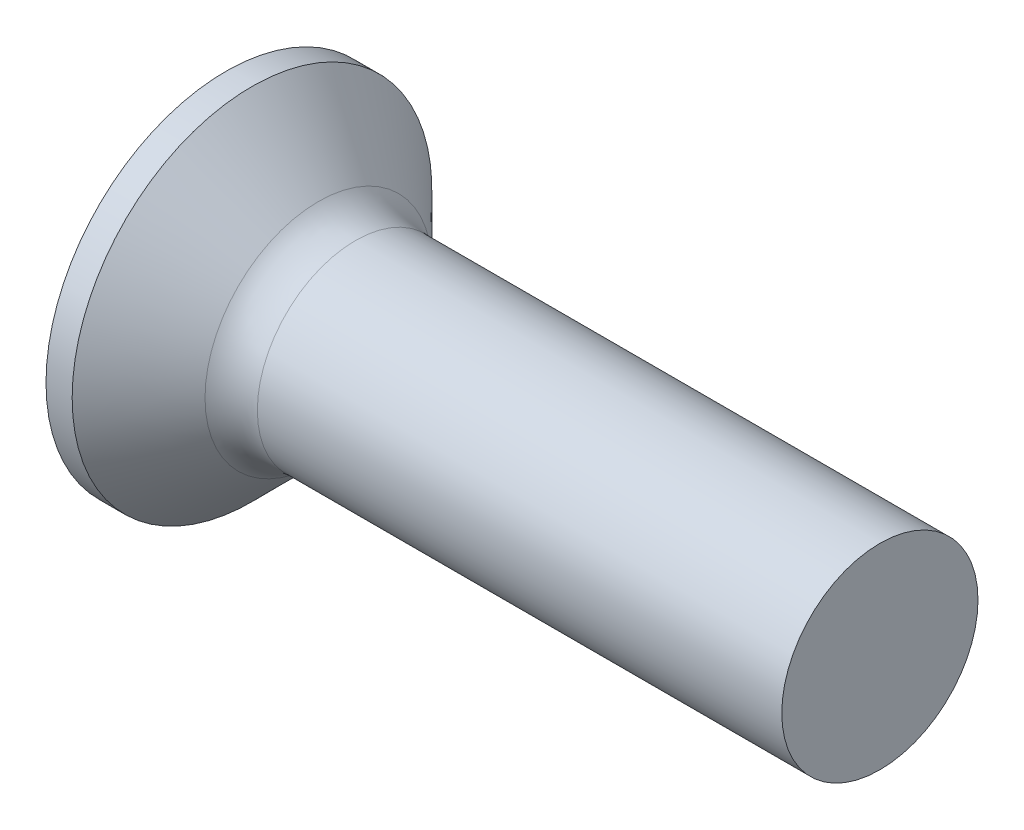
ISO-10303-21;
HEADER;
FILE_DESCRIPTION(('STEP AP214'),'2;1');
FILE_NAME('part.step','',(''),(''),'','','');
FILE_SCHEMA(('AUTOMOTIVE_DESIGN { 1 0 10303 214 1 1 1 1 }'));
ENDSEC;
DATA;
#1=APPLICATION_CONTEXT('core data for automotive mechanical design processes');
#2=APPLICATION_PROTOCOL_DEFINITION('international standard','automotive_design',2000,#1);
#3=PRODUCT_CONTEXT('',#1,'mechanical');
#4=PRODUCT('Part','Part','',(#3));
#5=PRODUCT_RELATED_PRODUCT_CATEGORY('part','',(#4));
#6=PRODUCT_DEFINITION_FORMATION('','',#4);
#7=PRODUCT_DEFINITION_CONTEXT('part definition',#1,'design');
#8=PRODUCT_DEFINITION('design','',#6,#7);
#9=PRODUCT_DEFINITION_SHAPE('','',#8);
#10=(LENGTH_UNIT() NAMED_UNIT(*) SI_UNIT(.MILLI.,.METRE.));
#11=(NAMED_UNIT(*) PLANE_ANGLE_UNIT() SI_UNIT($,.RADIAN.));
#12=(NAMED_UNIT(*) SI_UNIT($,.STERADIAN.) SOLID_ANGLE_UNIT());
#13=UNCERTAINTY_MEASURE_WITH_UNIT(LENGTH_MEASURE(1.E-05),#10,'distance_accuracy_value','');
#14=(GEOMETRIC_REPRESENTATION_CONTEXT(3) GLOBAL_UNCERTAINTY_ASSIGNED_CONTEXT((#13)) GLOBAL_UNIT_ASSIGNED_CONTEXT((#10,
#11,#12)) REPRESENTATION_CONTEXT('',''));
#15=CARTESIAN_POINT('',(0.,0.,0.));
#16=DIRECTION('',(0.,0.,1.));
#17=DIRECTION('',(1.,0.,0.));
#18=AXIS2_PLACEMENT_3D('',#15,#16,#17);
#19=CARTESIAN_POINT('',(2.01,-0.497851135403416,0.37));
#20=DIRECTION('',(0.,0.,-1.));
#21=DIRECTION('',(-1.,0.,0.));
#22=AXIS2_PLACEMENT_3D('',#19,#20,#21);
#23=PLANE('',#22);
#24=DIRECTION('',(0.,-1.,0.));
#25=VECTOR('',#24,1.);
#26=CARTESIAN_POINT('',(0.,1.5,0.37));
#27=LINE('',#26,#25);
#28=CARTESIAN_POINT('',(0.,-0.590157547916262,0.37));
#29=VERTEX_POINT('',#28);
#30=CARTESIAN_POINT('',(0.,-1.5,0.37));
#31=VERTEX_POINT('',#30);
#32=EDGE_CURVE('E462',#29,#31,#27,.T.);
#33=ORIENTED_EDGE('',*,*,#32,.F.);
#34=CARTESIAN_POINT('',(-1.01053649699026,-0.672102030078458,0.37));
#35=CARTESIAN_POINT('',(-0.799706058781647,-0.65526709888962,0.37));
#36=CARTESIAN_POINT('',(-0.588886212565098,-0.638297110577309,0.37));
#37=CARTESIAN_POINT('',(-0.167272662573758,-0.603984130523452,0.37));
#38=CARTESIAN_POINT('',(0.043521040593722,-0.586641131327184,0.37));
#39=CARTESIAN_POINT('',(0.465068838236452,-0.551479911668093,0.37));
#40=CARTESIAN_POINT('',(0.675822932725247,-0.533661691368078,0.37));
#41=CARTESIAN_POINT('',(1.09727362087867,-0.497387538868942,0.37));
#42=CARTESIAN_POINT('',(1.30797021528206,-0.478931615293403,0.37));
#43=CARTESIAN_POINT('',(1.67418894765493,-0.446067164114375,0.37));
#44=CARTESIAN_POINT('',(1.82972932594024,-0.431862501020784,0.37));
#45=CARTESIAN_POINT('',(2.14074770367772,-0.402797709732014,0.37));
#46=CARTESIAN_POINT('',(2.29622570364502,-0.387937587067169,0.37));
#47=CARTESIAN_POINT('',(2.60710169356699,-0.357305117929345,0.37));
#48=CARTESIAN_POINT('',(2.76249967848536,-0.341532719782114,0.37));
#49=CARTESIAN_POINT('',(2.99549070750468,-0.316847908272697,0.37));
#50=CARTESIAN_POINT('',(3.07313791127142,-0.308448465888147,0.37));
#51=CARTESIAN_POINT('',(3.22838341584044,-0.291202251038988,0.37));
#52=CARTESIAN_POINT('',(3.30598171607669,-0.282355473489552,0.370000000000001));
#53=CARTESIAN_POINT('',(3.38354828471668,-0.273232461280214,0.370000000000001));
#54=B_SPLINE_CURVE_WITH_KNOTS('',3,(#34,#35,#36,#37,#38,#39,#40,#41,#42,#43,#44,#45,#46,#47,#48,
#49,#50,#51,#52,#53),.UNSPECIFIED.,.F.,.F.,(4,2,2,2,2,2,2,2,2,4),(0.,0.634504777580944,
1.26902224771403,1.90353950046914,2.53804817608336,3.00661008454961,3.47516804035678,
3.94375256285268,4.17805198347564,4.41235406796205),.UNSPECIFIED.);
#55=CARTESIAN_POINT('',(2.01,-0.415013252800436,0.37));
#56=VERTEX_POINT('',#55);
#57=EDGE_CURVE('E218',#29,#56,#54,.T.);
#58=ORIENTED_EDGE('',*,*,#57,.T.);
#59=DIRECTION('',(0.,-1.,0.));
#60=VECTOR('',#59,1.);
#61=CARTESIAN_POINT('',(2.01,0.4978511354035,0.37));
#62=LINE('',#61,#60);
#63=CARTESIAN_POINT('',(2.01,-0.497851135403416,0.37));
#64=VERTEX_POINT('',#63);
#65=EDGE_CURVE('E371',#56,#64,#62,.T.);
#66=ORIENTED_EDGE('',*,*,#65,.T.);
#67=DIRECTION('',(0.894934391398435,0.446197753347451,0.));
#68=VECTOR('',#67,1.);
#69=CARTESIAN_POINT('',(0.,-1.5,0.37));
#70=LINE('',#69,#68);
#71=EDGE_CURVE('E470',#31,#64,#70,.T.);
#72=ORIENTED_EDGE('',*,*,#71,.F.);
#73=EDGE_LOOP('',(#33,#58,#66,#72));
#74=FACE_BOUND('',#73,.T.);
#75=ADVANCED_FACE('F39',(#74),#23,.T.);
#76=CARTESIAN_POINT('',(2.01,0.4978511354035,0.37));
#77=VERTEX_POINT('',#76);
#78=CARTESIAN_POINT('',(2.01,0.415013252800436,0.37));
#79=VERTEX_POINT('',#78);
#80=EDGE_CURVE('E367',#77,#79,#62,.T.);
#81=ORIENTED_EDGE('',*,*,#80,.T.);
#82=CARTESIAN_POINT('',(-1.01053649699026,0.672102030078458,0.37));
#83=CARTESIAN_POINT('',(-0.799706058781647,0.65526709888962,0.37));
#84=CARTESIAN_POINT('',(-0.588886212565098,0.638297110577309,0.37));
#85=CARTESIAN_POINT('',(-0.167272662573758,0.603984130523452,0.37));
#86=CARTESIAN_POINT('',(0.0435210405937223,0.586641131327184,0.37));
#87=CARTESIAN_POINT('',(0.465068838236453,0.551479911668093,0.37));
#88=CARTESIAN_POINT('',(0.675822932725247,0.533661691368078,0.37));
#89=CARTESIAN_POINT('',(1.09727362087867,0.497387538868942,0.37));
#90=CARTESIAN_POINT('',(1.30797021528206,0.478931615293403,0.37));
#91=CARTESIAN_POINT('',(1.67418894765493,0.446067164114375,0.37));
#92=CARTESIAN_POINT('',(1.82972932594024,0.431862501020784,0.37));
#93=CARTESIAN_POINT('',(2.14074770367772,0.402797709732014,0.37));
#94=CARTESIAN_POINT('',(2.29622570364503,0.387937587067169,0.37));
#95=CARTESIAN_POINT('',(2.60710169356699,0.357305117929345,0.37));
#96=CARTESIAN_POINT('',(2.76249967848536,0.341532719782114,0.37));
#97=CARTESIAN_POINT('',(2.99549070750468,0.316847908272697,0.37));
#98=CARTESIAN_POINT('',(3.07313791127142,0.308448465888147,0.37));
#99=CARTESIAN_POINT('',(3.22838341584044,0.291202251038988,0.37));
#100=CARTESIAN_POINT('',(3.30598171607669,0.282355473489552,0.37));
#101=CARTESIAN_POINT('',(3.38354828471668,0.273232461280214,0.37));
#102=B_SPLINE_CURVE_WITH_KNOTS('',3,(#82,#83,#84,#85,#86,#87,#88,#89,#90,#91,#92,#93,#94,#95,
#96,#97,#98,#99,#100,#101),.UNSPECIFIED.,.F.,.F.,(4,2,2,2,2,2,2,2,2,4),(0.,0.634504777580944,
1.26902224771403,1.90353950046914,2.53804817608336,3.00661008454961,3.47516804035678,
3.94375256285268,4.17805198347564,4.41235406796206),.UNSPECIFIED.);
#103=CARTESIAN_POINT('',(0.,0.590157547916262,0.37));
#104=VERTEX_POINT('',#103);
#105=EDGE_CURVE('E211',#79,#104,#102,.F.);
#106=ORIENTED_EDGE('',*,*,#105,.T.);
#107=CARTESIAN_POINT('',(0.,1.5,0.37));
#108=VERTEX_POINT('',#107);
#109=EDGE_CURVE('E464',#108,#104,#27,.T.);
#110=ORIENTED_EDGE('',*,*,#109,.F.);
#111=DIRECTION('',(0.89493439139845,-0.446197753347421,0.));
#112=VECTOR('',#111,1.);
#113=CARTESIAN_POINT('',(0.,1.5,0.37));
#114=LINE('',#113,#112);
#115=EDGE_CURVE('E62',#108,#77,#114,.T.);
#116=ORIENTED_EDGE('',*,*,#115,.T.);
#117=EDGE_LOOP('',(#81,#106,#110,#116));
#118=FACE_BOUND('',#117,.T.);
#119=ADVANCED_FACE('F193',(#118),#23,.T.);
#120=CARTESIAN_POINT('',(2.01,0.4978511354035,-0.37));
#121=DIRECTION('',(0.,0.,1.));
#122=DIRECTION('',(1.,0.,0.));
#123=AXIS2_PLACEMENT_3D('',#120,#121,#122);
#124=PLANE('',#123);
#125=DIRECTION('',(0.,1.,0.));
#126=VECTOR('',#125,1.);
#127=CARTESIAN_POINT('',(2.01,-0.497851135403416,-0.37));
#128=LINE('',#127,#126);
#129=CARTESIAN_POINT('',(2.01,-0.497851135403416,-0.37));
#130=VERTEX_POINT('',#129);
#131=CARTESIAN_POINT('',(2.01,-0.415013252800436,-0.37));
#132=VERTEX_POINT('',#131);
#133=EDGE_CURVE('E380',#130,#132,#128,.T.);
#134=ORIENTED_EDGE('',*,*,#133,.T.);
#135=CARTESIAN_POINT('',(-1.01053649699026,-0.672102030078459,-0.369999999999999));
#136=CARTESIAN_POINT('',(-0.799706058781647,-0.65526709888962,-0.369999999999999));
#137=CARTESIAN_POINT('',(-0.588886212565098,-0.63829711057731,-0.369999999999999));
#138=CARTESIAN_POINT('',(-0.167272662573758,-0.603984130523453,-0.369999999999999));
#139=CARTESIAN_POINT('',(0.0435210405937223,-0.586641131327185,-0.369999999999999));
#140=CARTESIAN_POINT('',(0.465068838236453,-0.551479911668094,-0.369999999999999));
#141=CARTESIAN_POINT('',(0.675822932725247,-0.533661691368078,-0.369999999999999));
#142=CARTESIAN_POINT('',(1.09727362087867,-0.497387538868943,-0.369999999999999));
#143=CARTESIAN_POINT('',(1.30797021528206,-0.478931615293404,-0.37));
#144=CARTESIAN_POINT('',(1.67418894765493,-0.446067164114376,-0.37));
#145=CARTESIAN_POINT('',(1.82972932594024,-0.431862501020785,-0.37));
#146=CARTESIAN_POINT('',(2.14074770367772,-0.402797709732015,-0.37));
#147=CARTESIAN_POINT('',(2.29622570364503,-0.387937587067169,-0.37));
#148=CARTESIAN_POINT('',(2.60710169356699,-0.357305117929345,-0.37));
#149=CARTESIAN_POINT('',(2.76249967848536,-0.341532719782114,-0.37));
#150=CARTESIAN_POINT('',(2.99549070750468,-0.316847908272697,-0.37));
#151=CARTESIAN_POINT('',(3.07313791127142,-0.308448465888147,-0.37));
#152=CARTESIAN_POINT('',(3.22838341584044,-0.291202251038988,-0.37));
#153=CARTESIAN_POINT('',(3.30598171607669,-0.282355473489552,-0.37));
#154=CARTESIAN_POINT('',(3.38354828471668,-0.273232461280214,-0.37));
#155=B_SPLINE_CURVE_WITH_KNOTS('',3,(#135,#136,#137,#138,#139,#140,#141,#142,#143,#144,#145,
#146,#147,#148,#149,#150,#151,#152,#153,#154),.UNSPECIFIED.,.F.,.F.,(4,2,2,2,2,2,2,2,2,4),(0.,
0.634504777580944,1.26902224771403,1.90353950046914,2.53804817608336,3.00661008454961,
3.47516804035678,3.94375256285268,4.17805198347564,4.41235406796206),.UNSPECIFIED.);
#156=CARTESIAN_POINT('',(0.,-0.590157547916263,-0.369999999999999));
#157=VERTEX_POINT('',#156);
#158=EDGE_CURVE('E274',#132,#157,#155,.F.);
#159=ORIENTED_EDGE('',*,*,#158,.T.);
#160=DIRECTION('',(0.,1.,0.));
#161=VECTOR('',#160,1.);
#162=CARTESIAN_POINT('',(0.,-1.5,-0.369999999999999));
#163=LINE('',#162,#161);
#164=CARTESIAN_POINT('',(0.,-1.5,-0.369999999999999));
#165=VERTEX_POINT('',#164);
#166=EDGE_CURVE('E463',#165,#157,#163,.T.);
#167=ORIENTED_EDGE('',*,*,#166,.F.);
#168=DIRECTION('',(0.894934391398435,0.446197753347451,0.));
#169=VECTOR('',#168,1.);
#170=CARTESIAN_POINT('',(0.,-1.5,-0.369999999999999));
#171=LINE('',#170,#169);
#172=EDGE_CURVE('E473',#165,#130,#171,.T.);
#173=ORIENTED_EDGE('',*,*,#172,.T.);
#174=EDGE_LOOP('',(#134,#159,#167,#173));
#175=FACE_BOUND('',#174,.T.);
#176=ADVANCED_FACE('F199',(#175),#124,.T.);
#177=CARTESIAN_POINT('',(0.,0.590157547916263,-0.369999999999999));
#178=VERTEX_POINT('',#177);
#179=CARTESIAN_POINT('',(0.,1.5,-0.369999999999999));
#180=VERTEX_POINT('',#179);
#181=EDGE_CURVE('E469',#178,#180,#163,.T.);
#182=ORIENTED_EDGE('',*,*,#181,.F.);
#183=CARTESIAN_POINT('',(-1.01053649699026,0.672102030078459,-0.369999999999999));
#184=CARTESIAN_POINT('',(-0.799706058781646,0.65526709888962,-0.369999999999999));
#185=CARTESIAN_POINT('',(-0.588886212565098,0.638297110577309,-0.369999999999999));
#186=CARTESIAN_POINT('',(-0.167272662573758,0.603984130523452,-0.369999999999999));
#187=CARTESIAN_POINT('',(0.0435210405937222,0.586641131327184,-0.369999999999999));
#188=CARTESIAN_POINT('',(0.465068838236452,0.551479911668094,-0.369999999999999));
#189=CARTESIAN_POINT('',(0.675822932725247,0.533661691368078,-0.369999999999999));
#190=CARTESIAN_POINT('',(1.09727362087867,0.497387538868942,-0.37));
#191=CARTESIAN_POINT('',(1.30797021528206,0.478931615293403,-0.37));
#192=CARTESIAN_POINT('',(1.67418894765493,0.446067164114375,-0.37));
#193=CARTESIAN_POINT('',(1.82972932594024,0.431862501020785,-0.37));
#194=CARTESIAN_POINT('',(2.14074770367772,0.402797709732015,-0.37));
#195=CARTESIAN_POINT('',(2.29622570364502,0.387937587067169,-0.37));
#196=CARTESIAN_POINT('',(2.60710169356699,0.357305117929345,-0.37));
#197=CARTESIAN_POINT('',(2.76249967848536,0.341532719782114,-0.37));
#198=CARTESIAN_POINT('',(2.99549070750468,0.316847908272697,-0.37));
#199=CARTESIAN_POINT('',(3.07313791127142,0.308448465888147,-0.37));
#200=CARTESIAN_POINT('',(3.22838341584044,0.291202251038988,-0.37));
#201=CARTESIAN_POINT('',(3.30598171607669,0.282355473489552,-0.37));
#202=CARTESIAN_POINT('',(3.38354828471668,0.273232461280214,-0.37));
#203=B_SPLINE_CURVE_WITH_KNOTS('',3,(#183,#184,#185,#186,#187,#188,#189,#190,#191,#192,#193,
#194,#195,#196,#197,#198,#199,#200,#201,#202),.UNSPECIFIED.,.F.,.F.,(4,2,2,2,2,2,2,2,2,4),(0.,
0.634504777580944,1.26902224771403,1.90353950046914,2.53804817608336,3.00661008454961,
3.47516804035678,3.94375256285268,4.17805198347564,4.41235406796206),.UNSPECIFIED.);
#204=CARTESIAN_POINT('',(2.01,0.415013252800436,-0.37));
#205=VERTEX_POINT('',#204);
#206=EDGE_CURVE('E268',#178,#205,#203,.T.);
#207=ORIENTED_EDGE('',*,*,#206,.T.);
#208=CARTESIAN_POINT('',(2.01,0.4978511354035,-0.37));
#209=VERTEX_POINT('',#208);
#210=EDGE_CURVE('E382',#205,#209,#128,.T.);
#211=ORIENTED_EDGE('',*,*,#210,.T.);
#212=DIRECTION('',(0.89493439139845,-0.446197753347421,0.));
#213=VECTOR('',#212,1.);
#214=CARTESIAN_POINT('',(0.,1.5,-0.369999999999999));
#215=LINE('',#214,#213);
#216=EDGE_CURVE('E379',#180,#209,#215,.T.);
#217=ORIENTED_EDGE('',*,*,#216,.F.);
#218=EDGE_LOOP('',(#182,#207,#211,#217));
#219=FACE_BOUND('',#218,.T.);
#220=ADVANCED_FACE('F480',(#219),#124,.T.);
#221=CARTESIAN_POINT('',(2.01,-0.497851135403416,-0.37));
#222=DIRECTION('',(-1.,0.,0.));
#223=DIRECTION('',(0.,0.,1.));
#224=AXIS2_PLACEMENT_3D('',#221,#222,#223);
#225=PLANE('',#224);
#226=DIRECTION('',(0.,-1.,0.));
#227=VECTOR('',#226,1.);
#228=CARTESIAN_POINT('',(2.01,0.369999999999998,0.497851135403501));
#229=LINE('',#228,#227);
#230=CARTESIAN_POINT('',(2.01,-0.247548473995388,0.497851135403499));
#231=VERTEX_POINT('',#230);
#232=CARTESIAN_POINT('',(2.01,-0.370000000000002,0.497851135403499));
#233=VERTEX_POINT('',#232);
#234=EDGE_CURVE('E452',#231,#233,#229,.T.);
#235=ORIENTED_EDGE('',*,*,#234,.F.);
#236=CARTESIAN_POINT('',(2.01,0.,0.));
#237=DIRECTION('',(-1.,0.,0.));
#238=DIRECTION('',(0.,0.,1.));
#239=AXIS2_PLACEMENT_3D('',#236,#237,#238);
#240=CIRCLE('',#239,0.555999999999999);
#241=CARTESIAN_POINT('',(2.01,-0.370000000000002,0.415013252800435));
#242=VERTEX_POINT('',#241);
#243=EDGE_CURVE('E54',#242,#231,#240,.T.);
#244=ORIENTED_EDGE('',*,*,#243,.F.);
#245=DIRECTION('',(0.,0.,-1.));
#246=VECTOR('',#245,1.);
#247=CARTESIAN_POINT('',(2.01,-0.370000000000002,0.497851135403499));
#248=LINE('',#247,#246);
#249=EDGE_CURVE('E453',#233,#242,#248,.T.);
#250=ORIENTED_EDGE('',*,*,#249,.F.);
#251=EDGE_LOOP('',(#235,#244,#250));
#252=FACE_BOUND('',#251,.T.);
#253=ADVANCED_FACE('F495',(#252),#225,.T.);
#254=ORIENTED_EDGE('',*,*,#65,.F.);
#255=CARTESIAN_POINT('',(2.01,-0.497851135403416,0.247548473995555));
#256=VERTEX_POINT('',#255);
#257=EDGE_CURVE('E336',#256,#56,#240,.T.);
#258=ORIENTED_EDGE('',*,*,#257,.F.);
#259=DIRECTION('',(0.,0.,-1.));
#260=VECTOR('',#259,1.);
#261=CARTESIAN_POINT('',(2.01,-0.497851135403416,0.37));
#262=LINE('',#261,#260);
#263=EDGE_CURVE('E373',#64,#256,#262,.T.);
#264=ORIENTED_EDGE('',*,*,#263,.F.);
#265=EDGE_LOOP('',(#254,#258,#264));
#266=FACE_BOUND('',#265,.T.);
#267=ADVANCED_FACE('F638',(#266),#225,.T.);
#268=CARTESIAN_POINT('',(2.01,-0.497851135403416,-0.247548473995555));
#269=VERTEX_POINT('',#268);
#270=EDGE_CURVE('E370',#269,#130,#262,.T.);
#271=ORIENTED_EDGE('',*,*,#270,.F.);
#272=EDGE_CURVE('E341',#132,#269,#240,.T.);
#273=ORIENTED_EDGE('',*,*,#272,.F.);
#274=ORIENTED_EDGE('',*,*,#133,.F.);
#275=EDGE_LOOP('',(#271,#273,#274));
#276=FACE_BOUND('',#275,.T.);
#277=ADVANCED_FACE('F649',(#276),#225,.T.);
#278=CARTESIAN_POINT('',(2.01,-0.369999999999999,-0.415013252800437));
#279=VERTEX_POINT('',#278);
#280=CARTESIAN_POINT('',(2.01,-0.369999999999999,-0.497851135403418));
#281=VERTEX_POINT('',#280);
#282=EDGE_CURVE('E451',#279,#281,#248,.T.);
#283=ORIENTED_EDGE('',*,*,#282,.F.);
#284=CARTESIAN_POINT('',(2.01,-0.247548473995553,-0.497851135403417));
#285=VERTEX_POINT('',#284);
#286=EDGE_CURVE('E346',#285,#279,#240,.T.);
#287=ORIENTED_EDGE('',*,*,#286,.F.);
#288=DIRECTION('',(0.,1.,0.));
#289=VECTOR('',#288,1.);
#290=CARTESIAN_POINT('',(2.01,-0.369999999999999,-0.497851135403418));
#291=LINE('',#290,#289);
#292=EDGE_CURVE('E447',#281,#285,#291,.T.);
#293=ORIENTED_EDGE('',*,*,#292,.F.);
#294=EDGE_LOOP('',(#283,#287,#293));
#295=FACE_BOUND('',#294,.T.);
#296=ADVANCED_FACE('F490',(#295),#225,.T.);
#297=CARTESIAN_POINT('',(2.01,0.247548473995556,-0.497851135403416));
#298=VERTEX_POINT('',#297);
#299=CARTESIAN_POINT('',(2.01,0.370000000000002,-0.497851135403415));
#300=VERTEX_POINT('',#299);
#301=EDGE_CURVE('E455',#298,#300,#291,.T.);
#302=ORIENTED_EDGE('',*,*,#301,.F.);
#303=CARTESIAN_POINT('',(2.01,0.370000000000001,-0.415013252800435));
#304=VERTEX_POINT('',#303);
#305=EDGE_CURVE('E351',#304,#298,#240,.T.);
#306=ORIENTED_EDGE('',*,*,#305,.F.);
#307=DIRECTION('',(0.,0.,1.));
#308=VECTOR('',#307,1.);
#309=CARTESIAN_POINT('',(2.01,0.370000000000002,-0.497851135403415));
#310=LINE('',#309,#308);
#311=EDGE_CURVE('E457',#300,#304,#310,.T.);
#312=ORIENTED_EDGE('',*,*,#311,.F.);
#313=EDGE_LOOP('',(#302,#306,#312));
#314=FACE_BOUND('',#313,.T.);
#315=ADVANCED_FACE('F484',(#314),#225,.T.);
#316=ORIENTED_EDGE('',*,*,#210,.F.);
#317=CARTESIAN_POINT('',(2.01,0.497851135403499,-0.247548473995388));
#318=VERTEX_POINT('',#317);
#319=EDGE_CURVE('E356',#318,#205,#240,.T.);
#320=ORIENTED_EDGE('',*,*,#319,.F.);
#321=DIRECTION('',(0.,0.,1.));
#322=VECTOR('',#321,1.);
#323=CARTESIAN_POINT('',(2.01,0.4978511354035,-0.37));
#324=LINE('',#323,#322);
#325=EDGE_CURVE('E375',#209,#318,#324,.T.);
#326=ORIENTED_EDGE('',*,*,#325,.F.);
#327=EDGE_LOOP('',(#316,#320,#326));
#328=FACE_BOUND('',#327,.T.);
#329=ADVANCED_FACE('F482',(#328),#225,.T.);
#330=CARTESIAN_POINT('',(2.01,0.4978511354035,0.247548473995387));
#331=VERTEX_POINT('',#330);
#332=EDGE_CURVE('E368',#331,#77,#324,.T.);
#333=ORIENTED_EDGE('',*,*,#332,.F.);
#334=EDGE_CURVE('E334',#79,#331,#240,.T.);
#335=ORIENTED_EDGE('',*,*,#334,.F.);
#336=ORIENTED_EDGE('',*,*,#80,.F.);
#337=EDGE_LOOP('',(#333,#335,#336));
#338=FACE_BOUND('',#337,.T.);
#339=ADVANCED_FACE('F366',(#338),#225,.T.);
#340=CARTESIAN_POINT('',(0.,-1.5,-0.369999999999999));
#341=DIRECTION('',(-0.446197753347451,0.894934391398435,0.));
#342=DIRECTION('',(-0.894934391398435,-0.446197753347451,0.));
#343=AXIS2_PLACEMENT_3D('',#340,#341,#342);
#344=PLANE('',#343);
#345=ORIENTED_EDGE('',*,*,#263,.T.);
#346=CARTESIAN_POINT('',(2.86902919914407,-0.0695550475538947,0.));
#347=DIRECTION('',(-0.446197753347451,0.894934391398435,0.));
#348=DIRECTION('',(-0.894934391398435,-0.446197753347451,0.));
#349=AXIS2_PLACEMENT_3D('',#346,#347,#348);
#350=ELLIPSE('',#349,1.11145971268774,0.491029001453366);
#351=EDGE_CURVE('E286',#256,#269,#350,.F.);
#352=ORIENTED_EDGE('',*,*,#351,.T.);
#353=ORIENTED_EDGE('',*,*,#270,.T.);
#354=ORIENTED_EDGE('',*,*,#172,.F.);
#355=DIRECTION('',(0.,0.,-1.));
#356=VECTOR('',#355,1.);
#357=CARTESIAN_POINT('',(0.,-1.5,0.37));
#358=LINE('',#357,#356);
#359=EDGE_CURVE('E387',#31,#165,#358,.T.);
#360=ORIENTED_EDGE('',*,*,#359,.F.);
#361=ORIENTED_EDGE('',*,*,#71,.T.);
#362=EDGE_LOOP('',(#345,#352,#353,#354,#360,#361));
#363=FACE_BOUND('',#362,.T.);
#364=ADVANCED_FACE('F205',(#363),#344,.T.);
#365=CARTESIAN_POINT('',(0.,1.5,0.37));
#366=DIRECTION('',(-0.446197753347421,-0.89493439139845,0.));
#367=DIRECTION('',(0.89493439139845,-0.446197753347421,0.));
#368=AXIS2_PLACEMENT_3D('',#365,#366,#367);
#369=PLANE('',#368);
#370=ORIENTED_EDGE('',*,*,#325,.T.);
#371=CARTESIAN_POINT('',(2.8690291991443,0.0695550475538987,0.));
#372=DIRECTION('',(-0.446197753347421,-0.89493439139845,0.));
#373=DIRECTION('',(-0.89493439139845,0.446197753347421,0.));
#374=AXIS2_PLACEMENT_3D('',#371,#372,#373);
#375=ELLIPSE('',#374,1.11145971268778,0.491029001453349);
#376=EDGE_CURVE('E291',#318,#331,#375,.F.);
#377=ORIENTED_EDGE('',*,*,#376,.T.);
#378=ORIENTED_EDGE('',*,*,#332,.T.);
#379=ORIENTED_EDGE('',*,*,#115,.F.);
#380=DIRECTION('',(0.,0.,1.));
#381=VECTOR('',#380,1.);
#382=CARTESIAN_POINT('',(0.,1.5,-0.369999999999999));
#383=LINE('',#382,#381);
#384=EDGE_CURVE('E459',#180,#108,#383,.T.);
#385=ORIENTED_EDGE('',*,*,#384,.F.);
#386=ORIENTED_EDGE('',*,*,#216,.T.);
#387=EDGE_LOOP('',(#370,#377,#378,#379,#385,#386));
#388=FACE_BOUND('',#387,.T.);
#389=ADVANCED_FACE('F478',(#388),#369,.T.);
#390=CARTESIAN_POINT('',(2.01,-0.369999999999999,-0.497851135403418));
#391=DIRECTION('',(0.,1.,0.));
#392=DIRECTION('',(-1.,0.,0.));
#393=AXIS2_PLACEMENT_3D('',#390,#391,#392);
#394=PLANE('',#393);
#395=DIRECTION('',(0.,0.,-1.));
#396=VECTOR('',#395,1.);
#397=CARTESIAN_POINT('',(0.,-0.370000000000005,1.5));
#398=LINE('',#397,#396);
#399=CARTESIAN_POINT('',(0.,-0.369999999999998,-0.590157547916264));
#400=VERTEX_POINT('',#399);
#401=CARTESIAN_POINT('',(0.,-0.369999999999995,-1.5));
#402=VERTEX_POINT('',#401);
#403=EDGE_CURVE('E429',#400,#402,#398,.T.);
#404=ORIENTED_EDGE('',*,*,#403,.F.);
#405=CARTESIAN_POINT('',(-1.01053649691082,-0.369999999999997,-0.672102030072118));
#406=CARTESIAN_POINT('',(-0.799706058711029,-0.369999999999998,-0.655267098883948));
#407=CARTESIAN_POINT('',(-0.588886212503303,-0.369999999999998,-0.638297110572312));
#408=CARTESIAN_POINT('',(-0.167272662529609,-0.369999999999998,-0.603984130519828));
#409=CARTESIAN_POINT('',(0.0435210406290478,-0.369999999999998,-0.586641131324259));
#410=CARTESIAN_POINT('',(0.465068838244709,-0.369999999999998,-0.551479911667386));
#411=CARTESIAN_POINT('',(0.67582293271526,-0.369999999999998,-0.53366169136891));
#412=CARTESIAN_POINT('',(1.09727362083221,-0.369999999999998,-0.497387538872971));
#413=CARTESIAN_POINT('',(1.30797021521736,-0.369999999999999,-0.47893161529909));
#414=CARTESIAN_POINT('',(1.67418894757201,-0.369999999999999,-0.446067164121906));
#415=CARTESIAN_POINT('',(1.82972932585734,-0.369999999999999,-0.431862501028415));
#416=CARTESIAN_POINT('',(2.14074770359484,-0.369999999999999,-0.40279770973988));
#417=CARTESIAN_POINT('',(2.29622570356215,-0.369999999999999,-0.38793758707517));
#418=CARTESIAN_POINT('',(2.60710169348415,-0.369999999999999,-0.357305117937676));
#419=CARTESIAN_POINT('',(2.76249967840253,-0.369999999999999,-0.34153271979064));
#420=CARTESIAN_POINT('',(2.99549070742189,-0.369999999999999,-0.316847908281595));
#421=CARTESIAN_POINT('',(3.07313791118864,-0.369999999999999,-0.308448465897182));
#422=CARTESIAN_POINT('',(3.22838341575769,-0.369999999999999,-0.291202251048339));
#423=CARTESIAN_POINT('',(3.30598171599396,-0.37,-0.282355473499082));
#424=CARTESIAN_POINT('',(3.38354828463398,-0.37,-0.27323246128995));
#425=B_SPLINE_CURVE_WITH_KNOTS('',3,(#405,#406,#407,#408,#409,#410,#411,#412,#413,#414,#415,
#416,#417,#418,#419,#420,#421,#422,#423,#424),.UNSPECIFIED.,.F.,.F.,(4,2,2,2,2,2,2,2,2,4),(0.,
0.634504777554396,1.26902224766093,1.90353950036111,2.53804817592041,3.00661008438666,
3.47516804019383,3.94375256268972,4.17805198331267,4.41235406779909),.UNSPECIFIED.);
#426=EDGE_CURVE('E260',#400,#279,#425,.T.);
#427=ORIENTED_EDGE('',*,*,#426,.T.);
#428=ORIENTED_EDGE('',*,*,#282,.T.);
#429=DIRECTION('',(0.894934391398435,0.,0.446197753347451));
#430=VECTOR('',#429,1.);
#431=CARTESIAN_POINT('',(0.,-0.369999999999995,-1.5));
#432=LINE('',#431,#430);
#433=EDGE_CURVE('E436',#402,#281,#432,.T.);
#434=ORIENTED_EDGE('',*,*,#433,.F.);
#435=EDGE_LOOP('',(#404,#427,#428,#434));
#436=FACE_BOUND('',#435,.T.);
#437=ADVANCED_FACE('F708',(#436),#394,.T.);
#438=CARTESIAN_POINT('',(2.01,0.369999999999998,0.497851135403501));
#439=DIRECTION('',(0.,-1.,0.));
#440=DIRECTION('',(1.,0.,0.));
#441=AXIS2_PLACEMENT_3D('',#438,#439,#440);
#442=PLANE('',#441);
#443=ORIENTED_EDGE('',*,*,#311,.T.);
#444=CARTESIAN_POINT('',(-1.01053649691082,0.370000000000001,-0.672102030072116));
#445=CARTESIAN_POINT('',(-0.799706058711029,0.370000000000001,-0.655267098883946));
#446=CARTESIAN_POINT('',(-0.588886212503304,0.370000000000001,-0.63829711057231));
#447=CARTESIAN_POINT('',(-0.16727266252961,0.370000000000001,-0.603984130519826));
#448=CARTESIAN_POINT('',(0.0435210406290473,0.370000000000001,-0.586641131324257));
#449=CARTESIAN_POINT('',(0.465068838244709,0.370000000000001,-0.551479911667383));
#450=CARTESIAN_POINT('',(0.67582293271526,0.370000000000001,-0.533661691368908));
#451=CARTESIAN_POINT('',(1.09727362083221,0.370000000000001,-0.497387538872969));
#452=CARTESIAN_POINT('',(1.30797021521736,0.370000000000001,-0.478931615299088));
#453=CARTESIAN_POINT('',(1.67418894757201,0.370000000000001,-0.446067164121904));
#454=CARTESIAN_POINT('',(1.82972932585734,0.370000000000001,-0.431862501028413));
#455=CARTESIAN_POINT('',(2.14074770359484,0.370000000000001,-0.402797709739878));
#456=CARTESIAN_POINT('',(2.29622570356215,0.370000000000001,-0.387937587075168));
#457=CARTESIAN_POINT('',(2.60710169348415,0.370000000000001,-0.357305117937674));
#458=CARTESIAN_POINT('',(2.76249967840253,0.370000000000001,-0.341532719790638));
#459=CARTESIAN_POINT('',(2.99549070742189,0.370000000000001,-0.316847908281592));
#460=CARTESIAN_POINT('',(3.07313791118864,0.370000000000001,-0.30844846589718));
#461=CARTESIAN_POINT('',(3.22838341575769,0.370000000000001,-0.291202251048337));
#462=CARTESIAN_POINT('',(3.30598171599396,0.370000000000001,-0.28235547349908));
#463=CARTESIAN_POINT('',(3.38354828463398,0.370000000000001,-0.273232461289948));
#464=B_SPLINE_CURVE_WITH_KNOTS('',3,(#444,#445,#446,#447,#448,#449,#450,#451,#452,#453,#454,
#455,#456,#457,#458,#459,#460,#461,#462,#463),.UNSPECIFIED.,.F.,.F.,(4,2,2,2,2,2,2,2,2,4),(0.,
0.634504777554396,1.26902224766093,1.90353950036111,2.53804817592041,3.00661008438666,
3.47516804019383,3.94375256268972,4.17805198331267,4.41235406779909),.UNSPECIFIED.);
#465=CARTESIAN_POINT('',(0.,0.370000000000001,-0.590157547916262));
#466=VERTEX_POINT('',#465);
#467=EDGE_CURVE('E253',#304,#466,#464,.F.);
#468=ORIENTED_EDGE('',*,*,#467,.T.);
#469=DIRECTION('',(0.,0.,1.));
#470=VECTOR('',#469,1.);
#471=CARTESIAN_POINT('',(0.,0.370000000000004,-1.5));
#472=LINE('',#471,#470);
#473=CARTESIAN_POINT('',(0.,0.370000000000004,-1.5));
#474=VERTEX_POINT('',#473);
#475=EDGE_CURVE('E433',#474,#466,#472,.T.);
#476=ORIENTED_EDGE('',*,*,#475,.F.);
#477=DIRECTION('',(0.894934391398435,0.,0.446197753347451));
#478=VECTOR('',#477,1.);
#479=CARTESIAN_POINT('',(0.,0.370000000000004,-1.5));
#480=LINE('',#479,#478);
#481=EDGE_CURVE('E439',#474,#300,#480,.T.);
#482=ORIENTED_EDGE('',*,*,#481,.T.);
#483=EDGE_LOOP('',(#443,#468,#476,#482));
#484=FACE_BOUND('',#483,.T.);
#485=ADVANCED_FACE('F717',(#484),#442,.T.);
#486=CARTESIAN_POINT('',(0.,0.370000000000004,-1.5));
#487=DIRECTION('',(-0.446197753347451,0.,0.894934391398435));
#488=DIRECTION('',(-0.894934391398435,0.,-0.446197753347451));
#489=AXIS2_PLACEMENT_3D('',#486,#487,#488);
#490=PLANE('',#489);
#491=ORIENTED_EDGE('',*,*,#292,.T.);
#492=CARTESIAN_POINT('',(2.86902919914407,0.,-0.0695550475538947));
#493=DIRECTION('',(-0.446197753347451,0.,0.894934391398435));
#494=DIRECTION('',(-0.894934391398435,0.,-0.446197753347451));
#495=AXIS2_PLACEMENT_3D('',#492,#493,#494);
#496=ELLIPSE('',#495,1.11145971268774,0.491029001453366);
#497=EDGE_CURVE('E303',#285,#298,#496,.F.);
#498=ORIENTED_EDGE('',*,*,#497,.T.);
#499=ORIENTED_EDGE('',*,*,#301,.T.);
#500=ORIENTED_EDGE('',*,*,#481,.F.);
#501=DIRECTION('',(0.,1.,0.));
#502=VECTOR('',#501,1.);
#503=CARTESIAN_POINT('',(0.,-0.369999999999995,-1.5));
#504=LINE('',#503,#502);
#505=EDGE_CURVE('E428',#402,#474,#504,.T.);
#506=ORIENTED_EDGE('',*,*,#505,.F.);
#507=ORIENTED_EDGE('',*,*,#433,.T.);
#508=EDGE_LOOP('',(#491,#498,#499,#500,#506,#507));
#509=FACE_BOUND('',#508,.T.);
#510=ADVANCED_FACE('F230',(#509),#490,.T.);
#511=ORIENTED_EDGE('',*,*,#249,.T.);
#512=CARTESIAN_POINT('',(-1.01053649691082,-0.370000000000002,0.672102030072116));
#513=CARTESIAN_POINT('',(-0.799706058711029,-0.370000000000002,0.655267098883945));
#514=CARTESIAN_POINT('',(-0.588886212503304,-0.370000000000002,0.638297110572309));
#515=CARTESIAN_POINT('',(-0.16727266252961,-0.370000000000002,0.603984130519826));
#516=CARTESIAN_POINT('',(0.0435210406290474,-0.370000000000002,0.586641131324257));
#517=CARTESIAN_POINT('',(0.465068838244709,-0.370000000000002,0.551479911667383));
#518=CARTESIAN_POINT('',(0.67582293271526,-0.370000000000002,0.533661691368907));
#519=CARTESIAN_POINT('',(1.09727362083221,-0.370000000000002,0.497387538872969));
#520=CARTESIAN_POINT('',(1.30797021521736,-0.370000000000002,0.478931615299087));
#521=CARTESIAN_POINT('',(1.67418894757201,-0.370000000000002,0.446067164121903));
#522=CARTESIAN_POINT('',(1.82972932585734,-0.370000000000002,0.431862501028412));
#523=CARTESIAN_POINT('',(2.14074770359484,-0.370000000000002,0.402797709739878));
#524=CARTESIAN_POINT('',(2.29622570356215,-0.370000000000002,0.387937587075168));
#525=CARTESIAN_POINT('',(2.60710169348415,-0.370000000000002,0.357305117937674));
#526=CARTESIAN_POINT('',(2.76249967840253,-0.370000000000002,0.341532719790637));
#527=CARTESIAN_POINT('',(2.99549070742189,-0.370000000000001,0.316847908281592));
#528=CARTESIAN_POINT('',(3.07313791118864,-0.370000000000001,0.30844846589718));
#529=CARTESIAN_POINT('',(3.22838341575769,-0.370000000000001,0.291202251048337));
#530=CARTESIAN_POINT('',(3.30598171599396,-0.370000000000001,0.28235547349908));
#531=CARTESIAN_POINT('',(3.38354828463398,-0.370000000000001,0.273232461289948));
#532=B_SPLINE_CURVE_WITH_KNOTS('',3,(#512,#513,#514,#515,#516,#517,#518,#519,#520,#521,#522,
#523,#524,#525,#526,#527,#528,#529,#530,#531),.UNSPECIFIED.,.F.,.F.,(4,2,2,2,2,2,2,2,2,4),(0.,
0.634504777554396,1.26902224766093,1.90353950036111,2.53804817592041,3.00661008438666,
3.47516804019383,3.94375256268972,4.17805198331267,4.41235406779909),.UNSPECIFIED.);
#533=CARTESIAN_POINT('',(0.,-0.370000000000002,0.590157547916261));
#534=VERTEX_POINT('',#533);
#535=EDGE_CURVE('E245',#242,#534,#532,.F.);
#536=ORIENTED_EDGE('',*,*,#535,.T.);
#537=CARTESIAN_POINT('',(0.,-0.370000000000005,1.5));
#538=VERTEX_POINT('',#537);
#539=EDGE_CURVE('E424',#538,#534,#398,.T.);
#540=ORIENTED_EDGE('',*,*,#539,.F.);
#541=DIRECTION('',(0.89493439139845,0.,-0.446197753347421));
#542=VECTOR('',#541,1.);
#543=CARTESIAN_POINT('',(0.,-0.370000000000005,1.5));
#544=LINE('',#543,#542);
#545=EDGE_CURVE('E442',#538,#233,#544,.T.);
#546=ORIENTED_EDGE('',*,*,#545,.T.);
#547=EDGE_LOOP('',(#511,#536,#540,#546));
#548=FACE_BOUND('',#547,.T.);
#549=ADVANCED_FACE('F718',(#548),#394,.T.);
#550=CARTESIAN_POINT('',(0.,0.369999999999997,0.590157547916264));
#551=VERTEX_POINT('',#550);
#552=CARTESIAN_POINT('',(0.,0.369999999999994,1.5));
#553=VERTEX_POINT('',#552);
#554=EDGE_CURVE('E435',#551,#553,#472,.T.);
#555=ORIENTED_EDGE('',*,*,#554,.F.);
#556=CARTESIAN_POINT('',(-1.01053649691082,0.369999999999996,0.672102030072119));
#557=CARTESIAN_POINT('',(-0.799706058711029,0.369999999999997,0.655267098883949));
#558=CARTESIAN_POINT('',(-0.588886212503304,0.369999999999997,0.638297110572313));
#559=CARTESIAN_POINT('',(-0.16727266252961,0.369999999999997,0.603984130519829));
#560=CARTESIAN_POINT('',(0.0435210406290474,0.369999999999997,0.58664113132426));
#561=CARTESIAN_POINT('',(0.465068838244709,0.369999999999997,0.551479911667386));
#562=CARTESIAN_POINT('',(0.67582293271526,0.369999999999998,0.53366169136891));
#563=CARTESIAN_POINT('',(1.09727362083221,0.369999999999998,0.497387538872972));
#564=CARTESIAN_POINT('',(1.30797021521736,0.369999999999998,0.47893161529909));
#565=CARTESIAN_POINT('',(1.67418894757201,0.369999999999998,0.446067164121906));
#566=CARTESIAN_POINT('',(1.82972932585734,0.369999999999998,0.431862501028415));
#567=CARTESIAN_POINT('',(2.14074770359484,0.369999999999999,0.40279770973988));
#568=CARTESIAN_POINT('',(2.29622570356215,0.369999999999999,0.387937587075171));
#569=CARTESIAN_POINT('',(2.60710169348415,0.369999999999999,0.357305117937677));
#570=CARTESIAN_POINT('',(2.76249967840253,0.369999999999999,0.34153271979064));
#571=CARTESIAN_POINT('',(2.99549070742189,0.369999999999999,0.316847908281595));
#572=CARTESIAN_POINT('',(3.07313791118864,0.369999999999999,0.308448465897182));
#573=CARTESIAN_POINT('',(3.22838341575769,0.369999999999999,0.291202251048339));
#574=CARTESIAN_POINT('',(3.30598171599396,0.369999999999999,0.282355473499082));
#575=CARTESIAN_POINT('',(3.38354828463398,0.37,0.273232461289951));
#576=B_SPLINE_CURVE_WITH_KNOTS('',3,(#556,#557,#558,#559,#560,#561,#562,#563,#564,#565,#566,
#567,#568,#569,#570,#571,#572,#573,#574,#575),.UNSPECIFIED.,.F.,.F.,(4,2,2,2,2,2,2,2,2,4),(0.,
0.634504777554396,1.26902224766093,1.90353950036111,2.53804817592041,3.00661008438666,
3.47516804019383,3.94375256268972,4.17805198331267,4.41235406779909),.UNSPECIFIED.);
#577=CARTESIAN_POINT('',(2.01,0.369999999999999,0.415013252800437));
#578=VERTEX_POINT('',#577);
#579=EDGE_CURVE('E235',#551,#578,#576,.T.);
#580=ORIENTED_EDGE('',*,*,#579,.T.);
#581=CARTESIAN_POINT('',(2.01,0.369999999999998,0.497851135403502));
#582=VERTEX_POINT('',#581);
#583=EDGE_CURVE('E225',#578,#582,#310,.T.);
#584=ORIENTED_EDGE('',*,*,#583,.T.);
#585=DIRECTION('',(0.89493439139845,0.,-0.446197753347421));
#586=VECTOR('',#585,1.);
#587=CARTESIAN_POINT('',(0.,0.369999999999994,1.5));
#588=LINE('',#587,#586);
#589=EDGE_CURVE('E444',#553,#582,#588,.T.);
#590=ORIENTED_EDGE('',*,*,#589,.F.);
#591=EDGE_LOOP('',(#555,#580,#584,#590));
#592=FACE_BOUND('',#591,.T.);
#593=ADVANCED_FACE('F727',(#592),#442,.T.);
#594=CARTESIAN_POINT('',(0.,-0.370000000000005,1.5));
#595=DIRECTION('',(-0.446197753347421,0.,-0.89493439139845));
#596=DIRECTION('',(0.89493439139845,0.,-0.446197753347421));
#597=AXIS2_PLACEMENT_3D('',#594,#595,#596);
#598=PLANE('',#597);
#599=CARTESIAN_POINT('',(2.01,0.247548473995386,0.4978511354035));
#600=VERTEX_POINT('',#599);
#601=EDGE_CURVE('E448',#582,#600,#229,.T.);
#602=ORIENTED_EDGE('',*,*,#601,.T.);
#603=CARTESIAN_POINT('',(2.8690291991443,0.,0.0695550475538987));
#604=DIRECTION('',(-0.446197753347421,0.,-0.89493439139845));
#605=DIRECTION('',(-0.89493439139845,0.,0.446197753347421));
#606=AXIS2_PLACEMENT_3D('',#603,#604,#605);
#607=ELLIPSE('',#606,1.11145971268778,0.491029001453349);
#608=EDGE_CURVE('E11',#600,#231,#607,.F.);
#609=ORIENTED_EDGE('',*,*,#608,.T.);
#610=ORIENTED_EDGE('',*,*,#234,.T.);
#611=ORIENTED_EDGE('',*,*,#545,.F.);
#612=DIRECTION('',(0.,-1.,0.));
#613=VECTOR('',#612,1.);
#614=CARTESIAN_POINT('',(0.,0.369999999999994,1.5));
#615=LINE('',#614,#613);
#616=EDGE_CURVE('E226',#553,#538,#615,.T.);
#617=ORIENTED_EDGE('',*,*,#616,.F.);
#618=ORIENTED_EDGE('',*,*,#589,.T.);
#619=EDGE_LOOP('',(#602,#609,#610,#611,#617,#618));
#620=FACE_BOUND('',#619,.T.);
#621=ADVANCED_FACE('F422',(#620),#598,.T.);
#622=CARTESIAN_POINT('',(0.,0.,0.));
#623=DIRECTION('',(-1.,0.,0.));
#624=DIRECTION('',(0.,0.,1.));
#625=AXIS2_PLACEMENT_3D('',#622,#623,#624);
#626=PLANE('',#625);
#627=CARTESIAN_POINT('',(0.,0.,0.));
#628=DIRECTION('',(-1.,0.,0.));
#629=DIRECTION('',(0.,0.,1.));
#630=AXIS2_PLACEMENT_3D('',#627,#628,#629);
#631=CIRCLE('',#630,2.75);
#632=CARTESIAN_POINT('',(0.,0.,2.75));
#633=VERTEX_POINT('',#632);
#634=EDGE_CURVE('E390',#633,#633,#631,.T.);
#635=ORIENTED_EDGE('',*,*,#634,.T.);
#636=EDGE_LOOP('',(#635));
#637=FACE_BOUND('',#636,.T.);
#638=ORIENTED_EDGE('',*,*,#539,.T.);
#639=CARTESIAN_POINT('',(0.,0.,0.));
#640=DIRECTION('',(-1.,0.,0.));
#641=DIRECTION('',(0.,0.,1.));
#642=AXIS2_PLACEMENT_3D('',#639,#640,#641);
#643=CIRCLE('',#642,0.69655289200644);
#644=EDGE_CURVE('E322',#29,#534,#643,.T.);
#645=ORIENTED_EDGE('',*,*,#644,.F.);
#646=ORIENTED_EDGE('',*,*,#32,.T.);
#647=ORIENTED_EDGE('',*,*,#359,.T.);
#648=ORIENTED_EDGE('',*,*,#166,.T.);
#649=EDGE_CURVE('E325',#400,#157,#643,.T.);
#650=ORIENTED_EDGE('',*,*,#649,.F.);
#651=ORIENTED_EDGE('',*,*,#403,.T.);
#652=ORIENTED_EDGE('',*,*,#505,.T.);
#653=ORIENTED_EDGE('',*,*,#475,.T.);
#654=EDGE_CURVE('E321',#178,#466,#643,.T.);
#655=ORIENTED_EDGE('',*,*,#654,.F.);
#656=ORIENTED_EDGE('',*,*,#181,.T.);
#657=ORIENTED_EDGE('',*,*,#384,.T.);
#658=ORIENTED_EDGE('',*,*,#109,.T.);
#659=EDGE_CURVE('E317',#551,#104,#643,.T.);
#660=ORIENTED_EDGE('',*,*,#659,.F.);
#661=ORIENTED_EDGE('',*,*,#554,.T.);
#662=ORIENTED_EDGE('',*,*,#616,.T.);
#663=EDGE_LOOP('',(#638,#645,#646,#647,#648,#650,#651,#652,#653,#655,#656,#657,#658,#660,#661,#662));
#664=FACE_BOUND('',#663,.T.);
#665=ADVANCED_FACE('F416',(#637,#664),#626,.T.);
#666=CARTESIAN_POINT('',(-6.34999999999999,0.,0.));
#667=DIRECTION('',(-1.,0.,0.));
#668=DIRECTION('',(0.,0.,1.));
#669=AXIS2_PLACEMENT_3D('',#666,#667,#668);
#670=CYLINDRICAL_SURFACE('',#669,2.75);
#671=CARTESIAN_POINT('',(0.400000000000005,0.,0.));
#672=DIRECTION('',(-1.,0.,0.));
#673=DIRECTION('',(0.,0.,1.));
#674=AXIS2_PLACEMENT_3D('',#671,#672,#673);
#675=CIRCLE('',#674,2.75);
#676=CARTESIAN_POINT('',(0.400000000000005,0.,2.75));
#677=VERTEX_POINT('',#676);
#678=EDGE_CURVE('E386',#677,#677,#675,.T.);
#679=ORIENTED_EDGE('',*,*,#678,.T.);
#680=EDGE_LOOP('',(#679));
#681=FACE_BOUND('',#680,.T.);
#682=ORIENTED_EDGE('',*,*,#634,.F.);
#683=EDGE_LOOP('',(#682));
#684=FACE_BOUND('',#683,.T.);
#685=ADVANCED_FACE('F410',(#681,#684),#670,.T.);
#686=CARTESIAN_POINT('',(0.400000000000005,0.,0.));
#687=DIRECTION('',(-1.,0.,0.));
#688=DIRECTION('',(0.,0.,1.));
#689=AXIS2_PLACEMENT_3D('',#686,#687,#688);
#690=CONICAL_SURFACE('',#689,2.75,0.78539816339745);
#691=CARTESIAN_POINT('',(1.41568542494924,0.,0.));
#692=DIRECTION('',(-1.,0.,0.));
#693=DIRECTION('',(0.,0.,1.));
#694=AXIS2_PLACEMENT_3D('',#691,#692,#693);
#695=CIRCLE('',#694,1.73431457505076);
#696=CARTESIAN_POINT('',(1.41568542494924,0.,1.73431457505076));
#697=VERTEX_POINT('',#696);
#698=EDGE_CURVE('E393',#697,#697,#695,.T.);
#699=ORIENTED_EDGE('',*,*,#698,.T.);
#700=EDGE_LOOP('',(#699));
#701=FACE_BOUND('',#700,.T.);
#702=ORIENTED_EDGE('',*,*,#678,.F.);
#703=EDGE_LOOP('',(#702));
#704=FACE_BOUND('',#703,.T.);
#705=ADVANCED_FACE('F407',(#701,#704),#690,.T.);
#706=CARTESIAN_POINT('',(-6.34999999999999,0.,0.));
#707=DIRECTION('',(-1.,0.,0.));
#708=DIRECTION('',(0.,0.,1.));
#709=AXIS2_PLACEMENT_3D('',#706,#707,#708);
#710=CYLINDRICAL_SURFACE('',#709,1.5);
#711=CARTESIAN_POINT('',(1.98137084989848,0.,0.));
#712=DIRECTION('',(-1.,0.,0.));
#713=DIRECTION('',(0.,0.,1.));
#714=AXIS2_PLACEMENT_3D('',#711,#712,#713);
#715=CIRCLE('',#714,1.5);
#716=CARTESIAN_POINT('',(1.98137084989848,0.,1.5));
#717=VERTEX_POINT('',#716);
#718=EDGE_CURVE('E47',#717,#717,#715,.F.);
#719=ORIENTED_EDGE('',*,*,#718,.T.);
#720=EDGE_LOOP('',(#719));
#721=FACE_BOUND('',#720,.T.);
#722=CARTESIAN_POINT('',(10.,0.,0.));
#723=DIRECTION('',(-1.,0.,0.));
#724=DIRECTION('',(0.,0.,1.));
#725=AXIS2_PLACEMENT_3D('',#722,#723,#724);
#726=CIRCLE('',#725,1.5);
#727=CARTESIAN_POINT('',(10.,0.,1.5));
#728=VERTEX_POINT('',#727);
#729=EDGE_CURVE('E383',#728,#728,#726,.T.);
#730=ORIENTED_EDGE('',*,*,#729,.T.);
#731=EDGE_LOOP('',(#730));
#732=FACE_BOUND('',#731,.T.);
#733=ADVANCED_FACE('F398',(#721,#732),#710,.T.);
#734=CARTESIAN_POINT('',(10.,1.5,0.));
#735=DIRECTION('',(1.,0.,0.));
#736=DIRECTION('',(0.,0.,-1.));
#737=AXIS2_PLACEMENT_3D('',#734,#735,#736);
#738=PLANE('',#737);
#739=ORIENTED_EDGE('',*,*,#729,.F.);
#740=EDGE_LOOP('',(#739));
#741=FACE_BOUND('',#740,.T.);
#742=ADVANCED_FACE('F404',(#741),#738,.T.);
#743=CARTESIAN_POINT('',(1.98137084989848,0.,0.));
#744=DIRECTION('',(-1.,0.,0.));
#745=DIRECTION('',(0.,0.,1.));
#746=AXIS2_PLACEMENT_3D('',#743,#744,#745);
#747=TOROIDAL_SURFACE('',#746,2.3,0.8);
#748=ORIENTED_EDGE('',*,*,#718,.F.);
#749=EDGE_LOOP('',(#748));
#750=FACE_BOUND('',#749,.T.);
#751=ORIENTED_EDGE('',*,*,#698,.F.);
#752=EDGE_LOOP('',(#751));
#753=FACE_BOUND('',#752,.T.);
#754=ADVANCED_FACE('F41',(#750,#753),#747,.F.);
#755=ORIENTED_EDGE('',*,*,#583,.F.);
#756=EDGE_CURVE('E327',#600,#578,#240,.T.);
#757=ORIENTED_EDGE('',*,*,#756,.F.);
#758=ORIENTED_EDGE('',*,*,#601,.F.);
#759=EDGE_LOOP('',(#755,#757,#758));
#760=FACE_BOUND('',#759,.T.);
#761=ADVANCED_FACE('F403',(#760),#225,.T.);
#762=CARTESIAN_POINT('',(2.01,0.,0.));
#763=DIRECTION('',(-1.,0.,0.));
#764=DIRECTION('',(0.,0.,1.));
#765=AXIS2_PLACEMENT_3D('',#762,#763,#764);
#766=CONICAL_SURFACE('',#765,0.555999999999999,0.069813170079766);
#767=ORIENTED_EDGE('',*,*,#644,.T.);
#768=ORIENTED_EDGE('',*,*,#535,.F.);
#769=EDGE_CURVE('E335',#56,#242,#240,.T.);
#770=ORIENTED_EDGE('',*,*,#769,.F.);
#771=ORIENTED_EDGE('',*,*,#57,.F.);
#772=EDGE_LOOP('',(#767,#768,#770,#771));
#773=FACE_BOUND('',#772,.T.);
#774=ADVANCED_FACE('F190',(#773),#766,.F.);
#775=EDGE_CURVE('E330',#578,#79,#240,.T.);
#776=ORIENTED_EDGE('',*,*,#775,.F.);
#777=ORIENTED_EDGE('',*,*,#579,.F.);
#778=ORIENTED_EDGE('',*,*,#659,.T.);
#779=ORIENTED_EDGE('',*,*,#105,.F.);
#780=EDGE_LOOP('',(#776,#777,#778,#779));
#781=FACE_BOUND('',#780,.T.);
#782=ADVANCED_FACE('F524',(#781),#766,.F.);
#783=EDGE_CURVE('E343',#279,#132,#240,.T.);
#784=ORIENTED_EDGE('',*,*,#783,.F.);
#785=ORIENTED_EDGE('',*,*,#426,.F.);
#786=ORIENTED_EDGE('',*,*,#649,.T.);
#787=ORIENTED_EDGE('',*,*,#158,.F.);
#788=EDGE_LOOP('',(#784,#785,#786,#787));
#789=FACE_BOUND('',#788,.T.);
#790=ADVANCED_FACE('F530',(#789),#766,.F.);
#791=ORIENTED_EDGE('',*,*,#654,.T.);
#792=ORIENTED_EDGE('',*,*,#467,.F.);
#793=EDGE_CURVE('E353',#205,#304,#240,.T.);
#794=ORIENTED_EDGE('',*,*,#793,.F.);
#795=ORIENTED_EDGE('',*,*,#206,.F.);
#796=EDGE_LOOP('',(#791,#792,#794,#795));
#797=FACE_BOUND('',#796,.T.);
#798=ADVANCED_FACE('F536',(#797),#766,.F.);
#799=EDGE_CURVE('E338',#269,#256,#240,.T.);
#800=ORIENTED_EDGE('',*,*,#799,.F.);
#801=ORIENTED_EDGE('',*,*,#351,.F.);
#802=EDGE_LOOP('',(#800,#801));
#803=FACE_BOUND('',#802,.T.);
#804=ADVANCED_FACE('F543',(#803),#766,.F.);
#805=EDGE_CURVE('E358',#331,#318,#240,.T.);
#806=ORIENTED_EDGE('',*,*,#805,.F.);
#807=ORIENTED_EDGE('',*,*,#376,.F.);
#808=EDGE_LOOP('',(#806,#807));
#809=FACE_BOUND('',#808,.T.);
#810=ADVANCED_FACE('F550',(#809),#766,.F.);
#811=EDGE_CURVE('E348',#298,#285,#240,.T.);
#812=ORIENTED_EDGE('',*,*,#811,.F.);
#813=ORIENTED_EDGE('',*,*,#497,.F.);
#814=EDGE_LOOP('',(#812,#813));
#815=FACE_BOUND('',#814,.T.);
#816=ADVANCED_FACE('F187',(#815),#766,.F.);
#817=EDGE_CURVE('E331',#231,#600,#240,.T.);
#818=ORIENTED_EDGE('',*,*,#817,.F.);
#819=ORIENTED_EDGE('',*,*,#608,.F.);
#820=EDGE_LOOP('',(#818,#819));
#821=FACE_BOUND('',#820,.T.);
#822=ADVANCED_FACE('F182',(#821),#766,.F.);
#823=CARTESIAN_POINT('',(2.19065535110549,0.,0.));
#824=DIRECTION('',(-1.,0.,0.));
#825=DIRECTION('',(0.,0.,1.));
#826=AXIS2_PLACEMENT_3D('',#823,#824,#825);
#827=CONICAL_SURFACE('',#826,0.,1.25663706143592);
#828=ORIENTED_EDGE('',*,*,#756,.T.);
#829=ORIENTED_EDGE('',*,*,#775,.T.);
#830=ORIENTED_EDGE('',*,*,#334,.T.);
#831=ORIENTED_EDGE('',*,*,#805,.T.);
#832=ORIENTED_EDGE('',*,*,#319,.T.);
#833=ORIENTED_EDGE('',*,*,#793,.T.);
#834=ORIENTED_EDGE('',*,*,#305,.T.);
#835=ORIENTED_EDGE('',*,*,#811,.T.);
#836=ORIENTED_EDGE('',*,*,#286,.T.);
#837=ORIENTED_EDGE('',*,*,#783,.T.);
#838=ORIENTED_EDGE('',*,*,#272,.T.);
#839=ORIENTED_EDGE('',*,*,#799,.T.);
#840=ORIENTED_EDGE('',*,*,#257,.T.);
#841=ORIENTED_EDGE('',*,*,#769,.T.);
#842=ORIENTED_EDGE('',*,*,#243,.T.);
#843=ORIENTED_EDGE('',*,*,#817,.T.);
#844=EDGE_LOOP('',(#828,#829,#830,#831,#832,#833,#834,#835,#836,#837,#838,#839,#840,#841,#842,#843));
#845=FACE_BOUND('',#844,.T.);
#846=CARTESIAN_POINT('',(2.19065535110549,0.,0.));
#847=VERTEX_POINT('',#846);
#848=VERTEX_LOOP('',#847);
#849=FACE_BOUND('',#848,.T.);
#850=ADVANCED_FACE('F180',(#845,#849),#827,.F.);
#851=CLOSED_SHELL('',(#75,#119,#176,#220,#253,#267,#277,#296,#315,#329,#339,#364,#389,#437,#485,
#510,#549,#593,#621,#665,#685,#705,#733,#742,#754,#761,#774,#782,#790,#798,#804,#810,#816,#822,#850));
#852=MANIFOLD_SOLID_BREP('B2',#851);
#853=ADVANCED_BREP_SHAPE_REPRESENTATION('',(#18,#852),#14);
#854=SHAPE_DEFINITION_REPRESENTATION(#9,#853);
ENDSEC;
END-ISO-10303-21;
